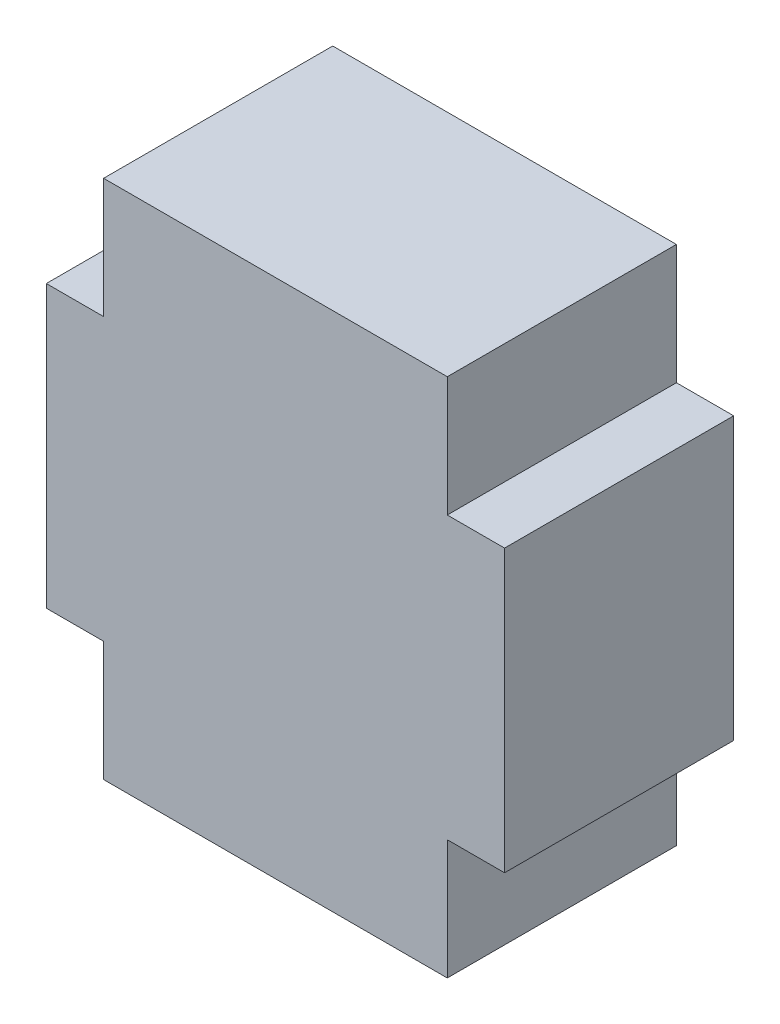
ISO-10303-21;
HEADER;
FILE_DESCRIPTION(('STEP AP214'),'2;1');
FILE_NAME('part.step','',(''),(''),'','','');
FILE_SCHEMA(('AUTOMOTIVE_DESIGN { 1 0 10303 214 1 1 1 1 }'));
ENDSEC;
DATA;
#1=APPLICATION_CONTEXT('core data for automotive mechanical design processes');
#2=APPLICATION_PROTOCOL_DEFINITION('international standard','automotive_design',2000,#1);
#3=PRODUCT_CONTEXT('',#1,'mechanical');
#4=PRODUCT('Part','Part','',(#3));
#5=PRODUCT_RELATED_PRODUCT_CATEGORY('part','',(#4));
#6=PRODUCT_DEFINITION_FORMATION('','',#4);
#7=PRODUCT_DEFINITION_CONTEXT('part definition',#1,'design');
#8=PRODUCT_DEFINITION('design','',#6,#7);
#9=PRODUCT_DEFINITION_SHAPE('','',#8);
#10=(LENGTH_UNIT() NAMED_UNIT(*) SI_UNIT(.MILLI.,.METRE.));
#11=(NAMED_UNIT(*) PLANE_ANGLE_UNIT() SI_UNIT($,.RADIAN.));
#12=(NAMED_UNIT(*) SI_UNIT($,.STERADIAN.) SOLID_ANGLE_UNIT());
#13=UNCERTAINTY_MEASURE_WITH_UNIT(LENGTH_MEASURE(1.E-05),#10,'distance_accuracy_value','');
#14=(GEOMETRIC_REPRESENTATION_CONTEXT(3) GLOBAL_UNCERTAINTY_ASSIGNED_CONTEXT((#13)) GLOBAL_UNIT_ASSIGNED_CONTEXT((#10,
#11,#12)) REPRESENTATION_CONTEXT('',''));
#15=CARTESIAN_POINT('',(0.,0.,0.));
#16=DIRECTION('',(0.,0.,1.));
#17=DIRECTION('',(1.,0.,0.));
#18=AXIS2_PLACEMENT_3D('',#15,#16,#17);
#19=CARTESIAN_POINT('',(1.1,0.675,1.1));
#20=DIRECTION('',(-1.,0.,0.));
#21=DIRECTION('',(0.,0.,1.));
#22=AXIS2_PLACEMENT_3D('',#19,#20,#21);
#23=PLANE('',#22);
#24=DIRECTION('',(0.,1.,0.));
#25=VECTOR('',#24,1.);
#26=CARTESIAN_POINT('',(1.1,0.675,0.));
#27=LINE('',#26,#25);
#28=CARTESIAN_POINT('',(1.1,-0.675,0.));
#29=VERTEX_POINT('',#28);
#30=CARTESIAN_POINT('',(1.1,0.675,0.));
#31=VERTEX_POINT('',#30);
#32=EDGE_CURVE('E154',#29,#31,#27,.T.);
#33=ORIENTED_EDGE('',*,*,#32,.T.);
#34=DIRECTION('',(0.,0.,-1.));
#35=VECTOR('',#34,1.);
#36=CARTESIAN_POINT('',(1.1,0.675,1.1));
#37=LINE('',#36,#35);
#38=CARTESIAN_POINT('',(1.1,0.675,1.1));
#39=VERTEX_POINT('',#38);
#40=EDGE_CURVE('E11',#39,#31,#37,.T.);
#41=ORIENTED_EDGE('',*,*,#40,.F.);
#42=DIRECTION('',(0.,1.,0.));
#43=VECTOR('',#42,1.);
#44=CARTESIAN_POINT('',(1.1,0.675,1.1));
#45=LINE('',#44,#43);
#46=CARTESIAN_POINT('',(1.1,-0.675,1.1));
#47=VERTEX_POINT('',#46);
#48=EDGE_CURVE('E176',#47,#39,#45,.T.);
#49=ORIENTED_EDGE('',*,*,#48,.F.);
#50=DIRECTION('',(0.,0.,-1.));
#51=VECTOR('',#50,1.);
#52=CARTESIAN_POINT('',(1.1,-0.675,1.1));
#53=LINE('',#52,#51);
#54=EDGE_CURVE('E150',#47,#29,#53,.T.);
#55=ORIENTED_EDGE('',*,*,#54,.T.);
#56=EDGE_LOOP('',(#33,#41,#49,#55));
#57=FACE_BOUND('',#56,.T.);
#58=ADVANCED_FACE('F34',(#57),#23,.F.);
#59=CARTESIAN_POINT('',(0.825,0.675,1.1));
#60=DIRECTION('',(0.,-1.,0.));
#61=DIRECTION('',(0.,0.,-1.));
#62=AXIS2_PLACEMENT_3D('',#59,#60,#61);
#63=PLANE('',#62);
#64=DIRECTION('',(-1.,0.,0.));
#65=VECTOR('',#64,1.);
#66=CARTESIAN_POINT('',(0.825,0.675,0.));
#67=LINE('',#66,#65);
#68=CARTESIAN_POINT('',(0.825,0.675,0.));
#69=VERTEX_POINT('',#68);
#70=EDGE_CURVE('E157',#31,#69,#67,.T.);
#71=ORIENTED_EDGE('',*,*,#70,.T.);
#72=DIRECTION('',(0.,0.,-1.));
#73=VECTOR('',#72,1.);
#74=CARTESIAN_POINT('',(0.825,0.675,1.1));
#75=LINE('',#74,#73);
#76=CARTESIAN_POINT('',(0.825,0.675,1.1));
#77=VERTEX_POINT('',#76);
#78=EDGE_CURVE('E42',#77,#69,#75,.T.);
#79=ORIENTED_EDGE('',*,*,#78,.F.);
#80=DIRECTION('',(-1.,0.,0.));
#81=VECTOR('',#80,1.);
#82=CARTESIAN_POINT('',(0.825,0.675,1.1));
#83=LINE('',#82,#81);
#84=EDGE_CURVE('E105',#39,#77,#83,.T.);
#85=ORIENTED_EDGE('',*,*,#84,.F.);
#86=ORIENTED_EDGE('',*,*,#40,.T.);
#87=EDGE_LOOP('',(#71,#79,#85,#86));
#88=FACE_BOUND('',#87,.T.);
#89=ADVANCED_FACE('F254',(#88),#63,.F.);
#90=CARTESIAN_POINT('',(0.825,1.25,1.1));
#91=DIRECTION('',(-1.,0.,0.));
#92=DIRECTION('',(0.,0.,1.));
#93=AXIS2_PLACEMENT_3D('',#90,#91,#92);
#94=PLANE('',#93);
#95=DIRECTION('',(0.,1.,0.));
#96=VECTOR('',#95,1.);
#97=CARTESIAN_POINT('',(0.825,1.25,0.));
#98=LINE('',#97,#96);
#99=CARTESIAN_POINT('',(0.825,1.25,0.));
#100=VERTEX_POINT('',#99);
#101=EDGE_CURVE('E159',#69,#100,#98,.T.);
#102=ORIENTED_EDGE('',*,*,#101,.T.);
#103=DIRECTION('',(0.,0.,-1.));
#104=VECTOR('',#103,1.);
#105=CARTESIAN_POINT('',(0.825,1.25,1.1));
#106=LINE('',#105,#104);
#107=CARTESIAN_POINT('',(0.825,1.25,1.1));
#108=VERTEX_POINT('',#107);
#109=EDGE_CURVE('E195',#108,#100,#106,.T.);
#110=ORIENTED_EDGE('',*,*,#109,.F.);
#111=DIRECTION('',(0.,1.,0.));
#112=VECTOR('',#111,1.);
#113=CARTESIAN_POINT('',(0.825,1.25,1.1));
#114=LINE('',#113,#112);
#115=EDGE_CURVE('E203',#77,#108,#114,.T.);
#116=ORIENTED_EDGE('',*,*,#115,.F.);
#117=ORIENTED_EDGE('',*,*,#78,.T.);
#118=EDGE_LOOP('',(#102,#110,#116,#117));
#119=FACE_BOUND('',#118,.T.);
#120=ADVANCED_FACE('F201',(#119),#94,.F.);
#121=CARTESIAN_POINT('',(-0.825,1.25,1.1));
#122=DIRECTION('',(0.,-1.,0.));
#123=DIRECTION('',(0.,0.,-1.));
#124=AXIS2_PLACEMENT_3D('',#121,#122,#123);
#125=PLANE('',#124);
#126=DIRECTION('',(-1.,0.,0.));
#127=VECTOR('',#126,1.);
#128=CARTESIAN_POINT('',(-0.825,1.25,0.));
#129=LINE('',#128,#127);
#130=CARTESIAN_POINT('',(-0.825,1.25,0.));
#131=VERTEX_POINT('',#130);
#132=EDGE_CURVE('E161',#100,#131,#129,.T.);
#133=ORIENTED_EDGE('',*,*,#132,.T.);
#134=DIRECTION('',(0.,0.,-1.));
#135=VECTOR('',#134,1.);
#136=CARTESIAN_POINT('',(-0.825,1.25,1.1));
#137=LINE('',#136,#135);
#138=CARTESIAN_POINT('',(-0.825,1.25,1.1));
#139=VERTEX_POINT('',#138);
#140=EDGE_CURVE('E192',#139,#131,#137,.T.);
#141=ORIENTED_EDGE('',*,*,#140,.F.);
#142=DIRECTION('',(-1.,0.,0.));
#143=VECTOR('',#142,1.);
#144=CARTESIAN_POINT('',(-0.825,1.25,1.1));
#145=LINE('',#144,#143);
#146=EDGE_CURVE('E221',#108,#139,#145,.T.);
#147=ORIENTED_EDGE('',*,*,#146,.F.);
#148=ORIENTED_EDGE('',*,*,#109,.T.);
#149=EDGE_LOOP('',(#133,#141,#147,#148));
#150=FACE_BOUND('',#149,.T.);
#151=ADVANCED_FACE('F212',(#150),#125,.F.);
#152=CARTESIAN_POINT('',(-0.825,0.675,1.1));
#153=DIRECTION('',(1.,0.,0.));
#154=DIRECTION('',(0.,0.,-1.));
#155=AXIS2_PLACEMENT_3D('',#152,#153,#154);
#156=PLANE('',#155);
#157=DIRECTION('',(0.,-1.,0.));
#158=VECTOR('',#157,1.);
#159=CARTESIAN_POINT('',(-0.825,0.675,0.));
#160=LINE('',#159,#158);
#161=CARTESIAN_POINT('',(-0.825,0.675,0.));
#162=VERTEX_POINT('',#161);
#163=EDGE_CURVE('E163',#131,#162,#160,.T.);
#164=ORIENTED_EDGE('',*,*,#163,.T.);
#165=DIRECTION('',(0.,0.,-1.));
#166=VECTOR('',#165,1.);
#167=CARTESIAN_POINT('',(-0.825,0.675,1.1));
#168=LINE('',#167,#166);
#169=CARTESIAN_POINT('',(-0.825,0.675,1.1));
#170=VERTEX_POINT('',#169);
#171=EDGE_CURVE('E189',#170,#162,#168,.T.);
#172=ORIENTED_EDGE('',*,*,#171,.F.);
#173=DIRECTION('',(0.,-1.,0.));
#174=VECTOR('',#173,1.);
#175=CARTESIAN_POINT('',(-0.825,0.675,1.1));
#176=LINE('',#175,#174);
#177=EDGE_CURVE('E218',#139,#170,#176,.T.);
#178=ORIENTED_EDGE('',*,*,#177,.F.);
#179=ORIENTED_EDGE('',*,*,#140,.T.);
#180=EDGE_LOOP('',(#164,#172,#178,#179));
#181=FACE_BOUND('',#180,.T.);
#182=ADVANCED_FACE('F216',(#181),#156,.F.);
#183=CARTESIAN_POINT('',(-1.1,0.675,1.1));
#184=DIRECTION('',(0.,-1.,0.));
#185=DIRECTION('',(0.,0.,-1.));
#186=AXIS2_PLACEMENT_3D('',#183,#184,#185);
#187=PLANE('',#186);
#188=DIRECTION('',(-1.,0.,0.));
#189=VECTOR('',#188,1.);
#190=CARTESIAN_POINT('',(-1.1,0.675,0.));
#191=LINE('',#190,#189);
#192=CARTESIAN_POINT('',(-1.1,0.675,0.));
#193=VERTEX_POINT('',#192);
#194=EDGE_CURVE('E165',#162,#193,#191,.T.);
#195=ORIENTED_EDGE('',*,*,#194,.T.);
#196=DIRECTION('',(0.,0.,-1.));
#197=VECTOR('',#196,1.);
#198=CARTESIAN_POINT('',(-1.1,0.675,1.1));
#199=LINE('',#198,#197);
#200=CARTESIAN_POINT('',(-1.1,0.675,1.1));
#201=VERTEX_POINT('',#200);
#202=EDGE_CURVE('E186',#201,#193,#199,.T.);
#203=ORIENTED_EDGE('',*,*,#202,.F.);
#204=DIRECTION('',(-1.,0.,0.));
#205=VECTOR('',#204,1.);
#206=CARTESIAN_POINT('',(-1.1,0.675,1.1));
#207=LINE('',#206,#205);
#208=EDGE_CURVE('E220',#170,#201,#207,.T.);
#209=ORIENTED_EDGE('',*,*,#208,.F.);
#210=ORIENTED_EDGE('',*,*,#171,.T.);
#211=EDGE_LOOP('',(#195,#203,#209,#210));
#212=FACE_BOUND('',#211,.T.);
#213=ADVANCED_FACE('F267',(#212),#187,.F.);
#214=CARTESIAN_POINT('',(-1.1,-0.675,1.1));
#215=DIRECTION('',(1.,0.,0.));
#216=DIRECTION('',(0.,0.,-1.));
#217=AXIS2_PLACEMENT_3D('',#214,#215,#216);
#218=PLANE('',#217);
#219=DIRECTION('',(0.,-1.,0.));
#220=VECTOR('',#219,1.);
#221=CARTESIAN_POINT('',(-1.1,-0.675,0.));
#222=LINE('',#221,#220);
#223=CARTESIAN_POINT('',(-1.1,-0.675,0.));
#224=VERTEX_POINT('',#223);
#225=EDGE_CURVE('E167',#193,#224,#222,.T.);
#226=ORIENTED_EDGE('',*,*,#225,.T.);
#227=DIRECTION('',(0.,0.,-1.));
#228=VECTOR('',#227,1.);
#229=CARTESIAN_POINT('',(-1.1,-0.675,1.1));
#230=LINE('',#229,#228);
#231=CARTESIAN_POINT('',(-1.1,-0.675,1.1));
#232=VERTEX_POINT('',#231);
#233=EDGE_CURVE('E183',#232,#224,#230,.T.);
#234=ORIENTED_EDGE('',*,*,#233,.F.);
#235=DIRECTION('',(0.,-1.,0.));
#236=VECTOR('',#235,1.);
#237=CARTESIAN_POINT('',(-1.1,-0.675,1.1));
#238=LINE('',#237,#236);
#239=EDGE_CURVE('E223',#201,#232,#238,.T.);
#240=ORIENTED_EDGE('',*,*,#239,.F.);
#241=ORIENTED_EDGE('',*,*,#202,.T.);
#242=EDGE_LOOP('',(#226,#234,#240,#241));
#243=FACE_BOUND('',#242,.T.);
#244=ADVANCED_FACE('F270',(#243),#218,.F.);
#245=CARTESIAN_POINT('',(-0.825,-0.675,1.1));
#246=DIRECTION('',(0.,1.,0.));
#247=DIRECTION('',(0.,0.,1.));
#248=AXIS2_PLACEMENT_3D('',#245,#246,#247);
#249=PLANE('',#248);
#250=DIRECTION('',(1.,0.,0.));
#251=VECTOR('',#250,1.);
#252=CARTESIAN_POINT('',(-0.825,-0.675,0.));
#253=LINE('',#252,#251);
#254=CARTESIAN_POINT('',(-0.825,-0.675,0.));
#255=VERTEX_POINT('',#254);
#256=EDGE_CURVE('E169',#224,#255,#253,.T.);
#257=ORIENTED_EDGE('',*,*,#256,.T.);
#258=DIRECTION('',(0.,0.,-1.));
#259=VECTOR('',#258,1.);
#260=CARTESIAN_POINT('',(-0.825,-0.675,1.1));
#261=LINE('',#260,#259);
#262=CARTESIAN_POINT('',(-0.825,-0.675,1.1));
#263=VERTEX_POINT('',#262);
#264=EDGE_CURVE('E180',#263,#255,#261,.T.);
#265=ORIENTED_EDGE('',*,*,#264,.F.);
#266=DIRECTION('',(1.,0.,0.));
#267=VECTOR('',#266,1.);
#268=CARTESIAN_POINT('',(-0.825,-0.675,1.1));
#269=LINE('',#268,#267);
#270=EDGE_CURVE('E229',#232,#263,#269,.T.);
#271=ORIENTED_EDGE('',*,*,#270,.F.);
#272=ORIENTED_EDGE('',*,*,#233,.T.);
#273=EDGE_LOOP('',(#257,#265,#271,#272));
#274=FACE_BOUND('',#273,.T.);
#275=ADVANCED_FACE('F235',(#274),#249,.F.);
#276=CARTESIAN_POINT('',(-0.825,-1.25,1.1));
#277=DIRECTION('',(1.,0.,0.));
#278=DIRECTION('',(0.,0.,-1.));
#279=AXIS2_PLACEMENT_3D('',#276,#277,#278);
#280=PLANE('',#279);
#281=DIRECTION('',(0.,-1.,0.));
#282=VECTOR('',#281,1.);
#283=CARTESIAN_POINT('',(-0.825,-1.25,0.));
#284=LINE('',#283,#282);
#285=CARTESIAN_POINT('',(-0.825,-1.25,0.));
#286=VERTEX_POINT('',#285);
#287=EDGE_CURVE('E171',#255,#286,#284,.T.);
#288=ORIENTED_EDGE('',*,*,#287,.T.);
#289=DIRECTION('',(0.,0.,-1.));
#290=VECTOR('',#289,1.);
#291=CARTESIAN_POINT('',(-0.825,-1.25,1.1));
#292=LINE('',#291,#290);
#293=CARTESIAN_POINT('',(-0.825,-1.25,1.1));
#294=VERTEX_POINT('',#293);
#295=EDGE_CURVE('E145',#294,#286,#292,.T.);
#296=ORIENTED_EDGE('',*,*,#295,.F.);
#297=DIRECTION('',(0.,-1.,0.));
#298=VECTOR('',#297,1.);
#299=CARTESIAN_POINT('',(-0.825,-1.25,1.1));
#300=LINE('',#299,#298);
#301=EDGE_CURVE('E136',#263,#294,#300,.T.);
#302=ORIENTED_EDGE('',*,*,#301,.F.);
#303=ORIENTED_EDGE('',*,*,#264,.T.);
#304=EDGE_LOOP('',(#288,#296,#302,#303));
#305=FACE_BOUND('',#304,.T.);
#306=ADVANCED_FACE('F239',(#305),#280,.F.);
#307=CARTESIAN_POINT('',(0.825,-1.25,1.1));
#308=DIRECTION('',(0.,1.,0.));
#309=DIRECTION('',(0.,0.,1.));
#310=AXIS2_PLACEMENT_3D('',#307,#308,#309);
#311=PLANE('',#310);
#312=DIRECTION('',(1.,0.,0.));
#313=VECTOR('',#312,1.);
#314=CARTESIAN_POINT('',(0.825,-1.25,0.));
#315=LINE('',#314,#313);
#316=CARTESIAN_POINT('',(0.825,-1.25,0.));
#317=VERTEX_POINT('',#316);
#318=EDGE_CURVE('E144',#286,#317,#315,.T.);
#319=ORIENTED_EDGE('',*,*,#318,.T.);
#320=DIRECTION('',(0.,0.,-1.));
#321=VECTOR('',#320,1.);
#322=CARTESIAN_POINT('',(0.825,-1.25,1.1));
#323=LINE('',#322,#321);
#324=CARTESIAN_POINT('',(0.825,-1.25,1.1));
#325=VERTEX_POINT('',#324);
#326=EDGE_CURVE('E141',#325,#317,#323,.T.);
#327=ORIENTED_EDGE('',*,*,#326,.F.);
#328=DIRECTION('',(1.,0.,0.));
#329=VECTOR('',#328,1.);
#330=CARTESIAN_POINT('',(0.825,-1.25,1.1));
#331=LINE('',#330,#329);
#332=EDGE_CURVE('E130',#294,#325,#331,.T.);
#333=ORIENTED_EDGE('',*,*,#332,.F.);
#334=ORIENTED_EDGE('',*,*,#295,.T.);
#335=EDGE_LOOP('',(#319,#327,#333,#334));
#336=FACE_BOUND('',#335,.T.);
#337=ADVANCED_FACE('F142',(#336),#311,.F.);
#338=CARTESIAN_POINT('',(0.825,-0.675,1.1));
#339=DIRECTION('',(-1.,0.,0.));
#340=DIRECTION('',(0.,0.,1.));
#341=AXIS2_PLACEMENT_3D('',#338,#339,#340);
#342=PLANE('',#341);
#343=DIRECTION('',(0.,1.,0.));
#344=VECTOR('',#343,1.);
#345=CARTESIAN_POINT('',(0.825,-0.675,0.));
#346=LINE('',#345,#344);
#347=CARTESIAN_POINT('',(0.825,-0.675,0.));
#348=VERTEX_POINT('',#347);
#349=EDGE_CURVE('E91',#317,#348,#346,.T.);
#350=ORIENTED_EDGE('',*,*,#349,.T.);
#351=DIRECTION('',(0.,0.,-1.));
#352=VECTOR('',#351,1.);
#353=CARTESIAN_POINT('',(0.825,-0.675,1.1));
#354=LINE('',#353,#352);
#355=CARTESIAN_POINT('',(0.825,-0.675,1.1));
#356=VERTEX_POINT('',#355);
#357=EDGE_CURVE('E146',#356,#348,#354,.T.);
#358=ORIENTED_EDGE('',*,*,#357,.F.);
#359=DIRECTION('',(0.,1.,0.));
#360=VECTOR('',#359,1.);
#361=CARTESIAN_POINT('',(0.825,-0.675,1.1));
#362=LINE('',#361,#360);
#363=EDGE_CURVE('E134',#325,#356,#362,.T.);
#364=ORIENTED_EDGE('',*,*,#363,.F.);
#365=ORIENTED_EDGE('',*,*,#326,.T.);
#366=EDGE_LOOP('',(#350,#358,#364,#365));
#367=FACE_BOUND('',#366,.T.);
#368=ADVANCED_FACE('F148',(#367),#342,.F.);
#369=CARTESIAN_POINT('',(1.1,-0.675,1.1));
#370=DIRECTION('',(0.,1.,0.));
#371=DIRECTION('',(0.,0.,1.));
#372=AXIS2_PLACEMENT_3D('',#369,#370,#371);
#373=PLANE('',#372);
#374=DIRECTION('',(1.,0.,0.));
#375=VECTOR('',#374,1.);
#376=CARTESIAN_POINT('',(1.1,-0.675,0.));
#377=LINE('',#376,#375);
#378=EDGE_CURVE('E97',#348,#29,#377,.T.);
#379=ORIENTED_EDGE('',*,*,#378,.T.);
#380=ORIENTED_EDGE('',*,*,#54,.F.);
#381=DIRECTION('',(1.,0.,0.));
#382=VECTOR('',#381,1.);
#383=CARTESIAN_POINT('',(1.1,-0.675,1.1));
#384=LINE('',#383,#382);
#385=EDGE_CURVE('E50',#356,#47,#384,.T.);
#386=ORIENTED_EDGE('',*,*,#385,.F.);
#387=ORIENTED_EDGE('',*,*,#357,.T.);
#388=EDGE_LOOP('',(#379,#380,#386,#387));
#389=FACE_BOUND('',#388,.T.);
#390=ADVANCED_FACE('F243',(#389),#373,.F.);
#391=CARTESIAN_POINT('',(0.,0.,1.1));
#392=DIRECTION('',(0.,0.,-1.));
#393=DIRECTION('',(-1.,0.,0.));
#394=AXIS2_PLACEMENT_3D('',#391,#392,#393);
#395=PLANE('',#394);
#396=ORIENTED_EDGE('',*,*,#48,.T.);
#397=ORIENTED_EDGE('',*,*,#84,.T.);
#398=ORIENTED_EDGE('',*,*,#115,.T.);
#399=ORIENTED_EDGE('',*,*,#146,.T.);
#400=ORIENTED_EDGE('',*,*,#177,.T.);
#401=ORIENTED_EDGE('',*,*,#208,.T.);
#402=ORIENTED_EDGE('',*,*,#239,.T.);
#403=ORIENTED_EDGE('',*,*,#270,.T.);
#404=ORIENTED_EDGE('',*,*,#301,.T.);
#405=ORIENTED_EDGE('',*,*,#332,.T.);
#406=ORIENTED_EDGE('',*,*,#363,.T.);
#407=ORIENTED_EDGE('',*,*,#385,.T.);
#408=EDGE_LOOP('',(#396,#397,#398,#399,#400,#401,#402,#403,#404,#405,#406,#407));
#409=FACE_BOUND('',#408,.T.);
#410=ADVANCED_FACE('F132',(#409),#395,.F.);
#411=CARTESIAN_POINT('',(0.,0.,0.));
#412=DIRECTION('',(0.,0.,-1.));
#413=DIRECTION('',(-1.,0.,0.));
#414=AXIS2_PLACEMENT_3D('',#411,#412,#413);
#415=PLANE('',#414);
#416=ORIENTED_EDGE('',*,*,#32,.F.);
#417=ORIENTED_EDGE('',*,*,#378,.F.);
#418=ORIENTED_EDGE('',*,*,#349,.F.);
#419=ORIENTED_EDGE('',*,*,#318,.F.);
#420=ORIENTED_EDGE('',*,*,#287,.F.);
#421=ORIENTED_EDGE('',*,*,#256,.F.);
#422=ORIENTED_EDGE('',*,*,#225,.F.);
#423=ORIENTED_EDGE('',*,*,#194,.F.);
#424=ORIENTED_EDGE('',*,*,#163,.F.);
#425=ORIENTED_EDGE('',*,*,#132,.F.);
#426=ORIENTED_EDGE('',*,*,#101,.F.);
#427=ORIENTED_EDGE('',*,*,#70,.F.);
#428=EDGE_LOOP('',(#416,#417,#418,#419,#420,#421,#422,#423,#424,#425,#426,#427));
#429=FACE_BOUND('',#428,.T.);
#430=ADVANCED_FACE('F207',(#429),#415,.T.);
#431=CLOSED_SHELL('',(#58,#89,#120,#151,#182,#213,#244,#275,#306,#337,#368,#390,#410,#430));
#432=MANIFOLD_SOLID_BREP('B2',#431);
#433=ADVANCED_BREP_SHAPE_REPRESENTATION('',(#18,#432),#14);
#434=SHAPE_DEFINITION_REPRESENTATION(#9,#433);
ENDSEC;
END-ISO-10303-21;
